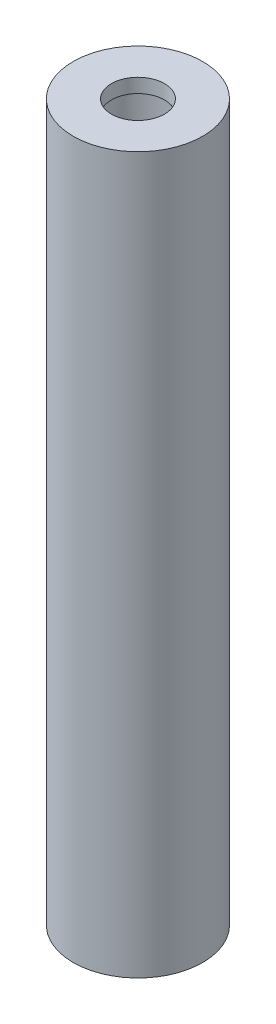
ISO-10303-21;
HEADER;
FILE_DESCRIPTION(('STEP AP214'),'2;1');
FILE_NAME('part.step','',(''),(''),'','','');
FILE_SCHEMA(('AUTOMOTIVE_DESIGN { 1 0 10303 214 1 1 1 1 }'));
ENDSEC;
DATA;
#1=APPLICATION_CONTEXT('core data for automotive mechanical design processes');
#2=APPLICATION_PROTOCOL_DEFINITION('international standard','automotive_design',2000,#1);
#3=PRODUCT_CONTEXT('',#1,'mechanical');
#4=PRODUCT('Part','Part','',(#3));
#5=PRODUCT_RELATED_PRODUCT_CATEGORY('part','',(#4));
#6=PRODUCT_DEFINITION_FORMATION('','',#4);
#7=PRODUCT_DEFINITION_CONTEXT('part definition',#1,'design');
#8=PRODUCT_DEFINITION('design','',#6,#7);
#9=PRODUCT_DEFINITION_SHAPE('','',#8);
#10=(LENGTH_UNIT() NAMED_UNIT(*) SI_UNIT(.MILLI.,.METRE.));
#11=(NAMED_UNIT(*) PLANE_ANGLE_UNIT() SI_UNIT($,.RADIAN.));
#12=(NAMED_UNIT(*) SI_UNIT($,.STERADIAN.) SOLID_ANGLE_UNIT());
#13=UNCERTAINTY_MEASURE_WITH_UNIT(LENGTH_MEASURE(1.E-05),#10,'distance_accuracy_value','');
#14=(GEOMETRIC_REPRESENTATION_CONTEXT(3) GLOBAL_UNCERTAINTY_ASSIGNED_CONTEXT((#13)) GLOBAL_UNIT_ASSIGNED_CONTEXT((#10,
#11,#12)) REPRESENTATION_CONTEXT('',''));
#15=CARTESIAN_POINT('',(0.,0.,0.));
#16=DIRECTION('',(0.,0.,1.));
#17=DIRECTION('',(1.,0.,0.));
#18=AXIS2_PLACEMENT_3D('',#15,#16,#17);
#19=CARTESIAN_POINT('',(0.,32.131,0.));
#20=DIRECTION('',(0.,-1.,0.));
#21=DIRECTION('',(0.,0.,-1.));
#22=AXIS2_PLACEMENT_3D('',#19,#20,#21);
#23=CYLINDRICAL_SURFACE('',#22,1.524);
#24=CARTESIAN_POINT('',(0.,0.,0.));
#25=DIRECTION('',(0.,1.,0.));
#26=DIRECTION('',(0.,0.,1.));
#27=AXIS2_PLACEMENT_3D('',#24,#25,#26);
#28=CIRCLE('',#27,1.524);
#29=CARTESIAN_POINT('',(0.,0.,1.524));
#30=VERTEX_POINT('',#29);
#31=EDGE_CURVE('E44',#30,#30,#28,.T.);
#32=ORIENTED_EDGE('',*,*,#31,.F.);
#33=EDGE_LOOP('',(#32));
#34=FACE_BOUND('',#33,.T.);
#35=CARTESIAN_POINT('',(0.,28.321,0.));
#36=DIRECTION('',(0.,1.,0.));
#37=DIRECTION('',(0.,0.,1.));
#38=AXIS2_PLACEMENT_3D('',#35,#36,#37);
#39=CIRCLE('',#38,1.524);
#40=CARTESIAN_POINT('',(0.,28.321,1.524));
#41=VERTEX_POINT('',#40);
#42=EDGE_CURVE('E35',#41,#41,#39,.T.);
#43=ORIENTED_EDGE('',*,*,#42,.T.);
#44=EDGE_LOOP('',(#43));
#45=FACE_BOUND('',#44,.T.);
#46=ADVANCED_FACE('F31',(#34,#45),#23,.F.);
#47=CARTESIAN_POINT('',(0.,32.131,0.));
#48=DIRECTION('',(0.,1.,0.));
#49=DIRECTION('',(0.,0.,1.));
#50=AXIS2_PLACEMENT_3D('',#47,#48,#49);
#51=PLANE('',#50);
#52=CARTESIAN_POINT('',(0.,32.131,0.));
#53=DIRECTION('',(0.,1.,0.));
#54=DIRECTION('',(0.,0.,1.));
#55=AXIS2_PLACEMENT_3D('',#52,#53,#54);
#56=CIRCLE('',#55,2.9083);
#57=CARTESIAN_POINT('',(0.,32.131,2.9083));
#58=VERTEX_POINT('',#57);
#59=EDGE_CURVE('E10',#58,#58,#56,.T.);
#60=ORIENTED_EDGE('',*,*,#59,.T.);
#61=EDGE_LOOP('',(#60));
#62=FACE_BOUND('',#61,.T.);
#63=CARTESIAN_POINT('',(0.,32.131,0.));
#64=DIRECTION('',(0.,1.,0.));
#65=DIRECTION('',(0.,0.,1.));
#66=AXIS2_PLACEMENT_3D('',#63,#64,#65);
#67=CIRCLE('',#66,1.190625);
#68=CARTESIAN_POINT('',(0.,32.131,1.190625));
#69=VERTEX_POINT('',#68);
#70=EDGE_CURVE('E51',#69,#69,#67,.T.);
#71=ORIENTED_EDGE('',*,*,#70,.F.);
#72=EDGE_LOOP('',(#71));
#73=FACE_BOUND('',#72,.T.);
#74=ADVANCED_FACE('F76',(#62,#73),#51,.T.);
#75=CARTESIAN_POINT('',(0.,0.,0.));
#76=DIRECTION('',(0.,1.,0.));
#77=DIRECTION('',(0.,0.,1.));
#78=AXIS2_PLACEMENT_3D('',#75,#76,#77);
#79=PLANE('',#78);
#80=CARTESIAN_POINT('',(0.,0.,0.));
#81=DIRECTION('',(0.,1.,0.));
#82=DIRECTION('',(0.,0.,1.));
#83=AXIS2_PLACEMENT_3D('',#80,#81,#82);
#84=CIRCLE('',#83,2.9083);
#85=CARTESIAN_POINT('',(0.,0.,2.9083));
#86=VERTEX_POINT('',#85);
#87=EDGE_CURVE('E39',#86,#86,#84,.T.);
#88=ORIENTED_EDGE('',*,*,#87,.F.);
#89=EDGE_LOOP('',(#88));
#90=FACE_BOUND('',#89,.T.);
#91=ORIENTED_EDGE('',*,*,#31,.T.);
#92=EDGE_LOOP('',(#91));
#93=FACE_BOUND('',#92,.T.);
#94=ADVANCED_FACE('F82',(#90,#93),#79,.F.);
#95=CARTESIAN_POINT('',(0.,32.131,0.));
#96=DIRECTION('',(0.,-1.,0.));
#97=DIRECTION('',(0.,0.,-1.));
#98=AXIS2_PLACEMENT_3D('',#95,#96,#97);
#99=CYLINDRICAL_SURFACE('',#98,2.9083);
#100=ORIENTED_EDGE('',*,*,#59,.F.);
#101=EDGE_LOOP('',(#100));
#102=FACE_BOUND('',#101,.T.);
#103=ORIENTED_EDGE('',*,*,#87,.T.);
#104=EDGE_LOOP('',(#103));
#105=FACE_BOUND('',#104,.T.);
#106=ADVANCED_FACE('F33',(#102,#105),#99,.T.);
#107=CARTESIAN_POINT('',(0.,27.1854770618868,0.));
#108=DIRECTION('',(0.,1.,0.));
#109=DIRECTION('',(0.,0.,1.));
#110=AXIS2_PLACEMENT_3D('',#107,#108,#109);
#111=CYLINDRICAL_SURFACE('',#110,1.190625);
#112=CARTESIAN_POINT('',(0.,31.496,0.));
#113=DIRECTION('',(0.,1.,0.));
#114=DIRECTION('',(0.,0.,1.));
#115=AXIS2_PLACEMENT_3D('',#112,#113,#114);
#116=CIRCLE('',#115,1.190625);
#117=CARTESIAN_POINT('',(0.,31.496,1.190625));
#118=VERTEX_POINT('',#117);
#119=EDGE_CURVE('E48',#118,#118,#116,.F.);
#120=ORIENTED_EDGE('',*,*,#119,.T.);
#121=EDGE_LOOP('',(#120));
#122=FACE_BOUND('',#121,.T.);
#123=ORIENTED_EDGE('',*,*,#70,.T.);
#124=EDGE_LOOP('',(#123));
#125=FACE_BOUND('',#124,.T.);
#126=ADVANCED_FACE('F86',(#122,#125),#111,.F.);
#127=CARTESIAN_POINT('',(0.,31.496,0.));
#128=DIRECTION('',(0.,1.,0.));
#129=DIRECTION('',(0.,0.,1.));
#130=AXIS2_PLACEMENT_3D('',#127,#128,#129);
#131=PLANE('',#130);
#132=ORIENTED_EDGE('',*,*,#119,.F.);
#133=EDGE_LOOP('',(#132));
#134=FACE_BOUND('',#133,.T.);
#135=CARTESIAN_POINT('',(0.,31.496,0.));
#136=DIRECTION('',(0.,1.,0.));
#137=DIRECTION('',(0.,0.,1.));
#138=AXIS2_PLACEMENT_3D('',#135,#136,#137);
#139=CIRCLE('',#138,1.7859375);
#140=CARTESIAN_POINT('',(0.,31.496,1.7859375));
#141=VERTEX_POINT('',#140);
#142=EDGE_CURVE('E54',#141,#141,#139,.T.);
#143=ORIENTED_EDGE('',*,*,#142,.F.);
#144=EDGE_LOOP('',(#143));
#145=FACE_BOUND('',#144,.T.);
#146=ADVANCED_FACE('F72',(#134,#145),#131,.F.);
#147=CARTESIAN_POINT('',(0.,28.321,0.));
#148=DIRECTION('',(0.,1.,0.));
#149=DIRECTION('',(0.,0.,1.));
#150=AXIS2_PLACEMENT_3D('',#147,#148,#149);
#151=CYLINDRICAL_SURFACE('',#150,1.7859375);
#152=CARTESIAN_POINT('',(0.,28.321,0.));
#153=DIRECTION('',(0.,1.,0.));
#154=DIRECTION('',(0.,0.,1.));
#155=AXIS2_PLACEMENT_3D('',#152,#153,#154);
#156=CIRCLE('',#155,1.7859375);
#157=CARTESIAN_POINT('',(0.,28.321,1.7859375));
#158=VERTEX_POINT('',#157);
#159=EDGE_CURVE('E57',#158,#158,#156,.T.);
#160=ORIENTED_EDGE('',*,*,#159,.F.);
#161=EDGE_LOOP('',(#160));
#162=FACE_BOUND('',#161,.T.);
#163=ORIENTED_EDGE('',*,*,#142,.T.);
#164=EDGE_LOOP('',(#163));
#165=FACE_BOUND('',#164,.T.);
#166=ADVANCED_FACE('F67',(#162,#165),#151,.F.);
#167=CARTESIAN_POINT('',(0.,28.321,0.));
#168=DIRECTION('',(0.,1.,0.));
#169=DIRECTION('',(0.,0.,1.));
#170=AXIS2_PLACEMENT_3D('',#167,#168,#169);
#171=PLANE('',#170);
#172=ORIENTED_EDGE('',*,*,#42,.F.);
#173=EDGE_LOOP('',(#172));
#174=FACE_BOUND('',#173,.T.);
#175=ORIENTED_EDGE('',*,*,#159,.T.);
#176=EDGE_LOOP('',(#175));
#177=FACE_BOUND('',#176,.T.);
#178=ADVANCED_FACE('F65',(#174,#177),#171,.T.);
#179=CLOSED_SHELL('',(#46,#74,#94,#106,#126,#146,#166,#178));
#180=MANIFOLD_SOLID_BREP('B2',#179);
#181=ADVANCED_BREP_SHAPE_REPRESENTATION('',(#18,#180),#14);
#182=SHAPE_DEFINITION_REPRESENTATION(#9,#181);
ENDSEC;
END-ISO-10303-21;
